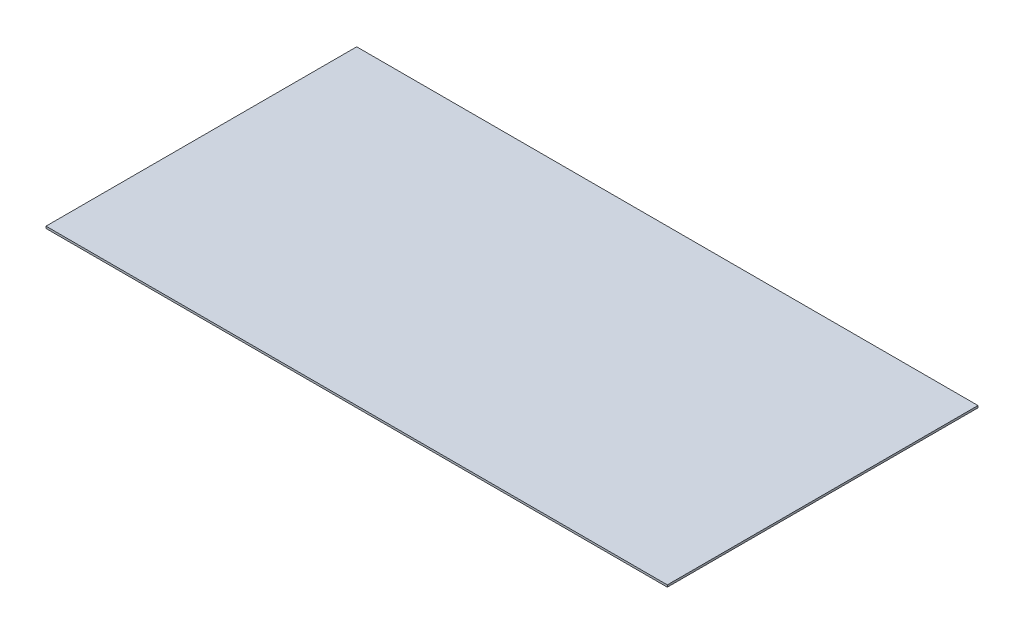
ISO-10303-21;
HEADER;
FILE_DESCRIPTION(('STEP AP214'),'2;1');
FILE_NAME('part.step','',(''),(''),'','','');
FILE_SCHEMA(('AUTOMOTIVE_DESIGN { 1 0 10303 214 1 1 1 1 }'));
ENDSEC;
DATA;
#1=APPLICATION_CONTEXT('core data for automotive mechanical design processes');
#2=APPLICATION_PROTOCOL_DEFINITION('international standard','automotive_design',2000,#1);
#3=PRODUCT_CONTEXT('',#1,'mechanical');
#4=PRODUCT('Part','Part','',(#3));
#5=PRODUCT_RELATED_PRODUCT_CATEGORY('part','',(#4));
#6=PRODUCT_DEFINITION_FORMATION('','',#4);
#7=PRODUCT_DEFINITION_CONTEXT('part definition',#1,'design');
#8=PRODUCT_DEFINITION('design','',#6,#7);
#9=PRODUCT_DEFINITION_SHAPE('','',#8);
#10=(LENGTH_UNIT() NAMED_UNIT(*) SI_UNIT(.MILLI.,.METRE.));
#11=(NAMED_UNIT(*) PLANE_ANGLE_UNIT() SI_UNIT($,.RADIAN.));
#12=(NAMED_UNIT(*) SI_UNIT($,.STERADIAN.) SOLID_ANGLE_UNIT());
#13=UNCERTAINTY_MEASURE_WITH_UNIT(LENGTH_MEASURE(1.E-05),#10,'distance_accuracy_value','');
#14=(GEOMETRIC_REPRESENTATION_CONTEXT(3) GLOBAL_UNCERTAINTY_ASSIGNED_CONTEXT((#13)) GLOBAL_UNIT_ASSIGNED_CONTEXT((#10,
#11,#12)) REPRESENTATION_CONTEXT('',''));
#15=CARTESIAN_POINT('',(0.,0.,0.));
#16=DIRECTION('',(0.,0.,1.));
#17=DIRECTION('',(1.,0.,0.));
#18=AXIS2_PLACEMENT_3D('',#15,#16,#17);
#19=CARTESIAN_POINT('',(1219.2,8.,-609.6));
#20=DIRECTION('',(-1.,0.,0.));
#21=DIRECTION('',(0.,0.,1.));
#22=AXIS2_PLACEMENT_3D('',#19,#20,#21);
#23=PLANE('',#22);
#24=DIRECTION('',(0.,0.,-1.));
#25=VECTOR('',#24,1.);
#26=CARTESIAN_POINT('',(1219.2,0.,-609.6));
#27=LINE('',#26,#25);
#28=CARTESIAN_POINT('',(1219.2,0.,609.6));
#29=VERTEX_POINT('',#28);
#30=CARTESIAN_POINT('',(1219.2,0.,-609.6));
#31=VERTEX_POINT('',#30);
#32=EDGE_CURVE('E113',#29,#31,#27,.T.);
#33=ORIENTED_EDGE('',*,*,#32,.T.);
#34=DIRECTION('',(0.,-1.,0.));
#35=VECTOR('',#34,1.);
#36=CARTESIAN_POINT('',(1219.2,8.,-609.6));
#37=LINE('',#36,#35);
#38=CARTESIAN_POINT('',(1219.2,8.,-609.6));
#39=VERTEX_POINT('',#38);
#40=EDGE_CURVE('E11',#39,#31,#37,.T.);
#41=ORIENTED_EDGE('',*,*,#40,.F.);
#42=DIRECTION('',(0.,0.,-1.));
#43=VECTOR('',#42,1.);
#44=CARTESIAN_POINT('',(1219.2,8.,-609.6));
#45=LINE('',#44,#43);
#46=CARTESIAN_POINT('',(1219.2,8.,609.6));
#47=VERTEX_POINT('',#46);
#48=EDGE_CURVE('E97',#47,#39,#45,.T.);
#49=ORIENTED_EDGE('',*,*,#48,.F.);
#50=DIRECTION('',(0.,-1.,0.));
#51=VECTOR('',#50,1.);
#52=CARTESIAN_POINT('',(1219.2,8.,609.6));
#53=LINE('',#52,#51);
#54=EDGE_CURVE('E109',#47,#29,#53,.T.);
#55=ORIENTED_EDGE('',*,*,#54,.T.);
#56=EDGE_LOOP('',(#33,#41,#49,#55));
#57=FACE_BOUND('',#56,.T.);
#58=ADVANCED_FACE('F45',(#57),#23,.F.);
#59=CARTESIAN_POINT('',(-1219.2,8.,-609.6));
#60=DIRECTION('',(0.,0.,1.));
#61=DIRECTION('',(1.,0.,0.));
#62=AXIS2_PLACEMENT_3D('',#59,#60,#61);
#63=PLANE('',#62);
#64=DIRECTION('',(-1.,0.,0.));
#65=VECTOR('',#64,1.);
#66=CARTESIAN_POINT('',(-1219.2,0.,-609.6));
#67=LINE('',#66,#65);
#68=CARTESIAN_POINT('',(-1219.2,0.,-609.6));
#69=VERTEX_POINT('',#68);
#70=EDGE_CURVE('E102',#31,#69,#67,.T.);
#71=ORIENTED_EDGE('',*,*,#70,.T.);
#72=DIRECTION('',(0.,-1.,0.));
#73=VECTOR('',#72,1.);
#74=CARTESIAN_POINT('',(-1219.2,8.,-609.6));
#75=LINE('',#74,#73);
#76=CARTESIAN_POINT('',(-1219.2,8.,-609.6));
#77=VERTEX_POINT('',#76);
#78=EDGE_CURVE('E54',#77,#69,#75,.T.);
#79=ORIENTED_EDGE('',*,*,#78,.F.);
#80=DIRECTION('',(-1.,0.,0.));
#81=VECTOR('',#80,1.);
#82=CARTESIAN_POINT('',(-1219.2,8.,-609.6));
#83=LINE('',#82,#81);
#84=EDGE_CURVE('E92',#39,#77,#83,.T.);
#85=ORIENTED_EDGE('',*,*,#84,.F.);
#86=ORIENTED_EDGE('',*,*,#40,.T.);
#87=EDGE_LOOP('',(#71,#79,#85,#86));
#88=FACE_BOUND('',#87,.T.);
#89=ADVANCED_FACE('F101',(#88),#63,.F.);
#90=CARTESIAN_POINT('',(-1219.2,8.,-609.6));
#91=DIRECTION('',(1.,0.,0.));
#92=DIRECTION('',(0.,0.,-1.));
#93=AXIS2_PLACEMENT_3D('',#90,#91,#92);
#94=PLANE('',#93);
#95=DIRECTION('',(0.,0.,1.));
#96=VECTOR('',#95,1.);
#97=CARTESIAN_POINT('',(-1219.2,0.,-609.6));
#98=LINE('',#97,#96);
#99=CARTESIAN_POINT('',(-1219.2,0.,609.6));
#100=VERTEX_POINT('',#99);
#101=EDGE_CURVE('E79',#69,#100,#98,.T.);
#102=ORIENTED_EDGE('',*,*,#101,.T.);
#103=DIRECTION('',(0.,-1.,0.));
#104=VECTOR('',#103,1.);
#105=CARTESIAN_POINT('',(-1219.2,8.,609.6));
#106=LINE('',#105,#104);
#107=CARTESIAN_POINT('',(-1219.2,8.,609.6));
#108=VERTEX_POINT('',#107);
#109=EDGE_CURVE('E104',#108,#100,#106,.T.);
#110=ORIENTED_EDGE('',*,*,#109,.F.);
#111=DIRECTION('',(0.,0.,1.));
#112=VECTOR('',#111,1.);
#113=CARTESIAN_POINT('',(-1219.2,8.,-609.6));
#114=LINE('',#113,#112);
#115=EDGE_CURVE('E95',#77,#108,#114,.T.);
#116=ORIENTED_EDGE('',*,*,#115,.F.);
#117=ORIENTED_EDGE('',*,*,#78,.T.);
#118=EDGE_LOOP('',(#102,#110,#116,#117));
#119=FACE_BOUND('',#118,.T.);
#120=ADVANCED_FACE('F105',(#119),#94,.F.);
#121=CARTESIAN_POINT('',(-1219.2,8.,609.6));
#122=DIRECTION('',(0.,0.,-1.));
#123=DIRECTION('',(-1.,0.,0.));
#124=AXIS2_PLACEMENT_3D('',#121,#122,#123);
#125=PLANE('',#124);
#126=DIRECTION('',(1.,0.,0.));
#127=VECTOR('',#126,1.);
#128=CARTESIAN_POINT('',(-1219.2,0.,609.6));
#129=LINE('',#128,#127);
#130=EDGE_CURVE('E85',#100,#29,#129,.T.);
#131=ORIENTED_EDGE('',*,*,#130,.T.);
#132=ORIENTED_EDGE('',*,*,#54,.F.);
#133=DIRECTION('',(1.,0.,0.));
#134=VECTOR('',#133,1.);
#135=CARTESIAN_POINT('',(-1219.2,8.,609.6));
#136=LINE('',#135,#134);
#137=EDGE_CURVE('E62',#108,#47,#136,.T.);
#138=ORIENTED_EDGE('',*,*,#137,.F.);
#139=ORIENTED_EDGE('',*,*,#109,.T.);
#140=EDGE_LOOP('',(#131,#132,#138,#139));
#141=FACE_BOUND('',#140,.T.);
#142=ADVANCED_FACE('F126',(#141),#125,.F.);
#143=CARTESIAN_POINT('',(0.,8.,0.));
#144=DIRECTION('',(0.,1.,0.));
#145=DIRECTION('',(0.,0.,1.));
#146=AXIS2_PLACEMENT_3D('',#143,#144,#145);
#147=PLANE('',#146);
#148=ORIENTED_EDGE('',*,*,#48,.T.);
#149=ORIENTED_EDGE('',*,*,#84,.T.);
#150=ORIENTED_EDGE('',*,*,#115,.T.);
#151=ORIENTED_EDGE('',*,*,#137,.T.);
#152=EDGE_LOOP('',(#148,#149,#150,#151));
#153=FACE_BOUND('',#152,.T.);
#154=ADVANCED_FACE('F93',(#153),#147,.T.);
#155=CARTESIAN_POINT('',(0.,0.,0.));
#156=DIRECTION('',(0.,1.,0.));
#157=DIRECTION('',(0.,0.,1.));
#158=AXIS2_PLACEMENT_3D('',#155,#156,#157);
#159=PLANE('',#158);
#160=ORIENTED_EDGE('',*,*,#32,.F.);
#161=ORIENTED_EDGE('',*,*,#130,.F.);
#162=ORIENTED_EDGE('',*,*,#101,.F.);
#163=ORIENTED_EDGE('',*,*,#70,.F.);
#164=EDGE_LOOP('',(#160,#161,#162,#163));
#165=FACE_BOUND('',#164,.T.);
#166=ADVANCED_FACE('F129',(#165),#159,.F.);
#167=CLOSED_SHELL('',(#58,#89,#120,#142,#154,#166));
#168=MANIFOLD_SOLID_BREP('B2',#167);
#169=ADVANCED_BREP_SHAPE_REPRESENTATION('',(#18,#168),#14);
#170=SHAPE_DEFINITION_REPRESENTATION(#9,#169);
ENDSEC;
END-ISO-10303-21;
